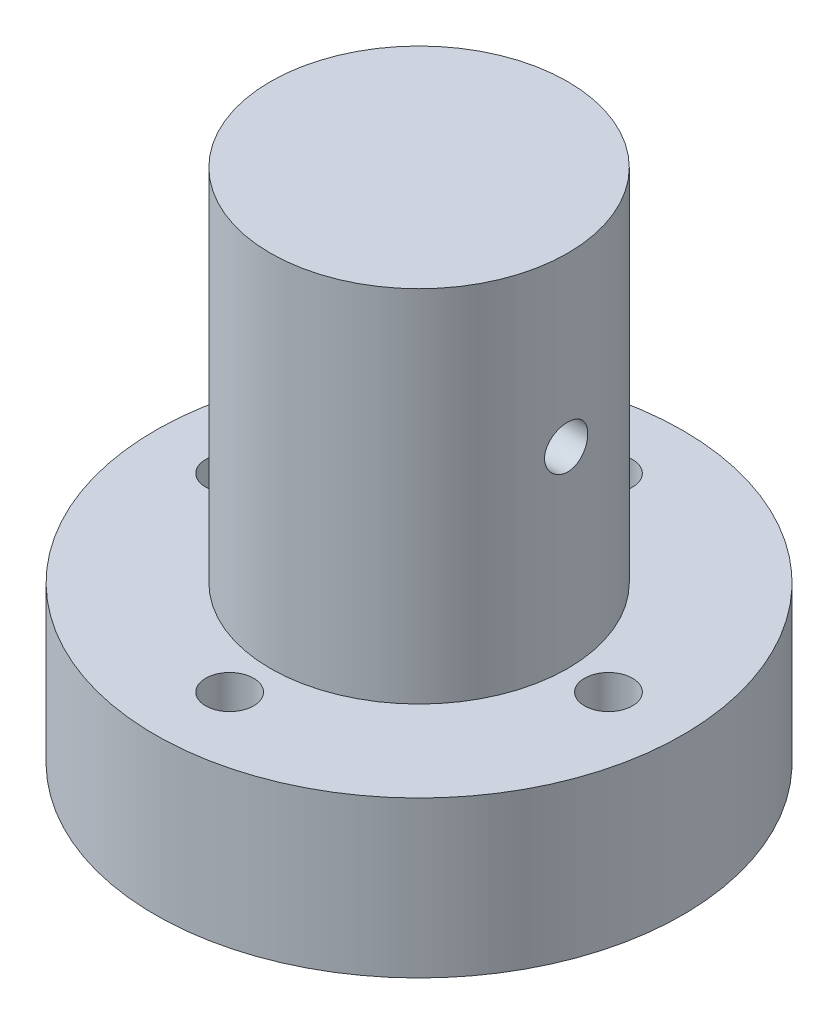
ISO-10303-21;
HEADER;
FILE_DESCRIPTION(('STEP AP214'),'2;1');
FILE_NAME('part.step','',(''),(''),'','','');
FILE_SCHEMA(('AUTOMOTIVE_DESIGN { 1 0 10303 214 1 1 1 1 }'));
ENDSEC;
DATA;
#1=APPLICATION_CONTEXT('core data for automotive mechanical design processes');
#2=APPLICATION_PROTOCOL_DEFINITION('international standard','automotive_design',2000,#1);
#3=PRODUCT_CONTEXT('',#1,'mechanical');
#4=PRODUCT('Part','Part','',(#3));
#5=PRODUCT_RELATED_PRODUCT_CATEGORY('part','',(#4));
#6=PRODUCT_DEFINITION_FORMATION('','',#4);
#7=PRODUCT_DEFINITION_CONTEXT('part definition',#1,'design');
#8=PRODUCT_DEFINITION('design','',#6,#7);
#9=PRODUCT_DEFINITION_SHAPE('','',#8);
#10=(LENGTH_UNIT() NAMED_UNIT(*) SI_UNIT(.MILLI.,.METRE.));
#11=(NAMED_UNIT(*) PLANE_ANGLE_UNIT() SI_UNIT($,.RADIAN.));
#12=(NAMED_UNIT(*) SI_UNIT($,.STERADIAN.) SOLID_ANGLE_UNIT());
#13=UNCERTAINTY_MEASURE_WITH_UNIT(LENGTH_MEASURE(1.E-05),#10,'distance_accuracy_value','');
#14=(GEOMETRIC_REPRESENTATION_CONTEXT(3) GLOBAL_UNCERTAINTY_ASSIGNED_CONTEXT((#13)) GLOBAL_UNIT_ASSIGNED_CONTEXT((#10,
#11,#12)) REPRESENTATION_CONTEXT('',''));
#15=CARTESIAN_POINT('',(0.,0.,0.));
#16=DIRECTION('',(0.,0.,1.));
#17=DIRECTION('',(1.,0.,0.));
#18=AXIS2_PLACEMENT_3D('',#15,#16,#17);
#19=CARTESIAN_POINT('',(0.,6.5,0.));
#20=DIRECTION('',(0.,-1.,0.));
#21=DIRECTION('',(0.,0.,-1.));
#22=AXIS2_PLACEMENT_3D('',#19,#20,#21);
#23=CYLINDRICAL_SURFACE('',#22,11.);
#24=CARTESIAN_POINT('',(0.,6.5,0.));
#25=DIRECTION('',(0.,1.,0.));
#26=DIRECTION('',(0.,0.,1.));
#27=AXIS2_PLACEMENT_3D('',#24,#25,#26);
#28=CIRCLE('',#27,11.);
#29=CARTESIAN_POINT('',(0.,6.5,-11.));
#30=VERTEX_POINT('',#29);
#31=EDGE_CURVE('E10',#30,#30,#28,.T.);
#32=CARTESIAN_POINT('',(0.,0.,0.));
#33=DIRECTION('',(0.,1.,0.));
#34=DIRECTION('',(0.,0.,1.));
#35=AXIS2_PLACEMENT_3D('',#32,#33,#34);
#36=CIRCLE('',#35,11.);
#37=CARTESIAN_POINT('',(0.,0.,-11.));
#38=VERTEX_POINT('',#37);
#39=EDGE_CURVE('E42',#38,#38,#36,.T.);
#40=CARTESIAN_POINT('',(0.,6.5,-11.));
#41=CARTESIAN_POINT('',(0.,6.43229166666667,-11.));
#42=CARTESIAN_POINT('',(0.,6.36458333333333,-11.));
#43=CARTESIAN_POINT('',(0.,6.22916666666667,-11.));
#44=CARTESIAN_POINT('',(0.,6.16145833333333,-11.));
#45=CARTESIAN_POINT('',(0.,6.02604166666667,-11.));
#46=CARTESIAN_POINT('',(0.,5.95833333333333,-11.));
#47=CARTESIAN_POINT('',(0.,5.82291666666667,-11.));
#48=CARTESIAN_POINT('',(0.,5.75520833333333,-11.));
#49=CARTESIAN_POINT('',(0.,5.61979166666667,-11.));
#50=CARTESIAN_POINT('',(0.,5.55208333333333,-11.));
#51=CARTESIAN_POINT('',(0.,5.41666666666667,-11.));
#52=CARTESIAN_POINT('',(0.,5.34895833333333,-11.));
#53=CARTESIAN_POINT('',(0.,5.21354166666667,-11.));
#54=CARTESIAN_POINT('',(0.,5.14583333333333,-11.));
#55=CARTESIAN_POINT('',(0.,5.01041666666667,-11.));
#56=CARTESIAN_POINT('',(0.,4.94270833333333,-11.));
#57=CARTESIAN_POINT('',(0.,4.80729166666667,-11.));
#58=CARTESIAN_POINT('',(0.,4.73958333333333,-11.));
#59=CARTESIAN_POINT('',(0.,4.60416666666667,-11.));
#60=CARTESIAN_POINT('',(0.,4.53645833333333,-11.));
#61=CARTESIAN_POINT('',(0.,4.40104166666667,-11.));
#62=CARTESIAN_POINT('',(0.,4.33333333333333,-11.));
#63=CARTESIAN_POINT('',(0.,4.19791666666667,-11.));
#64=CARTESIAN_POINT('',(0.,4.13020833333333,-11.));
#65=CARTESIAN_POINT('',(0.,3.99479166666667,-11.));
#66=CARTESIAN_POINT('',(0.,3.92708333333333,-11.));
#67=CARTESIAN_POINT('',(0.,3.79166666666667,-11.));
#68=CARTESIAN_POINT('',(0.,3.72395833333333,-11.));
#69=CARTESIAN_POINT('',(0.,3.58854166666667,-11.));
#70=CARTESIAN_POINT('',(0.,3.52083333333333,-11.));
#71=CARTESIAN_POINT('',(0.,3.38541666666667,-11.));
#72=CARTESIAN_POINT('',(0.,3.31770833333333,-11.));
#73=CARTESIAN_POINT('',(0.,3.18229166666667,-11.));
#74=CARTESIAN_POINT('',(0.,3.11458333333333,-11.));
#75=CARTESIAN_POINT('',(0.,2.97916666666667,-11.));
#76=CARTESIAN_POINT('',(0.,2.91145833333333,-11.));
#77=CARTESIAN_POINT('',(0.,2.77604166666667,-11.));
#78=CARTESIAN_POINT('',(0.,2.70833333333333,-11.));
#79=CARTESIAN_POINT('',(0.,2.57291666666667,-11.));
#80=CARTESIAN_POINT('',(0.,2.50520833333333,-11.));
#81=CARTESIAN_POINT('',(0.,2.36979166666667,-11.));
#82=CARTESIAN_POINT('',(0.,2.30208333333333,-11.));
#83=CARTESIAN_POINT('',(0.,2.16666666666667,-11.));
#84=CARTESIAN_POINT('',(0.,2.09895833333333,-11.));
#85=CARTESIAN_POINT('',(0.,1.96354166666667,-11.));
#86=CARTESIAN_POINT('',(0.,1.89583333333333,-11.));
#87=CARTESIAN_POINT('',(0.,1.76041666666667,-11.));
#88=CARTESIAN_POINT('',(0.,1.69270833333333,-11.));
#89=CARTESIAN_POINT('',(0.,1.55729166666667,-11.));
#90=CARTESIAN_POINT('',(0.,1.48958333333333,-11.));
#91=CARTESIAN_POINT('',(0.,1.35416666666667,-11.));
#92=CARTESIAN_POINT('',(0.,1.28645833333333,-11.));
#93=CARTESIAN_POINT('',(0.,1.15104166666667,-11.));
#94=CARTESIAN_POINT('',(0.,1.08333333333333,-11.));
#95=CARTESIAN_POINT('',(0.,0.947916666666667,-11.));
#96=CARTESIAN_POINT('',(0.,0.880208333333333,-11.));
#97=CARTESIAN_POINT('',(0.,0.744791666666667,-11.));
#98=CARTESIAN_POINT('',(0.,0.677083333333333,-11.));
#99=CARTESIAN_POINT('',(0.,0.541666666666667,-11.));
#100=CARTESIAN_POINT('',(0.,0.473958333333333,-11.));
#101=CARTESIAN_POINT('',(0.,0.338541666666667,-11.));
#102=CARTESIAN_POINT('',(0.,0.270833333333334,-11.));
#103=CARTESIAN_POINT('',(0.,0.135416666666667,-11.));
#104=CARTESIAN_POINT('',(0.,0.0677083333333334,-11.));
#105=CARTESIAN_POINT('',(0.,0.,-11.));
#106=B_SPLINE_CURVE_WITH_KNOTS('',3,(#40,#41,#42,#43,#44,#45,#46,#47,#48,#49,#50,#51,#52,#53,
#54,#55,#56,#57,#58,#59,#60,#61,#62,#63,#64,#65,#66,#67,#68,#69,#70,#71,#72,#73,#74,#75,#76,#77,
#78,#79,#80,#81,#82,#83,#84,#85,#86,#87,#88,#89,#90,#91,#92,#93,#94,#95,#96,#97,#98,#99,#100,
#101,#102,#103,#104,#105),.UNSPECIFIED.,.F.,.F.,(4,2,2,2,2,2,2,2,2,2,2,2,2,2,2,2,2,2,2,2,2,2,2,
2,2,2,2,2,2,2,2,2,4),(0.,0.203125,0.40625,0.609375000000001,0.812500000000001,1.015625,1.21875,
1.421875,1.625,1.828125,2.03125,2.234375,2.4375,2.640625,2.84375,3.046875,3.25,3.453125,3.65625,
3.859375,4.0625,4.265625,4.46875,4.671875,4.875,5.078125,5.28125,5.484375,5.6875,5.890625,
6.09375,6.296875,6.5),.UNSPECIFIED.);
#107=EDGE_CURVE('BSEAM31',#30,#38,#106,.T.);
#108=ORIENTED_EDGE('',*,*,#31,.F.);
#109=ORIENTED_EDGE('',*,*,#39,.T.);
#110=ORIENTED_EDGE('',*,*,#107,.T.);
#111=ORIENTED_EDGE('',*,*,#107,.F.);
#112=EDGE_LOOP('',(#108,#110,#109,#111));
#113=FACE_BOUND('',#112,.T.);
#114=ADVANCED_FACE('F31',(#113),#23,.T.);
#115=CARTESIAN_POINT('',(0.,6.5,0.));
#116=DIRECTION('',(0.,1.,0.));
#117=DIRECTION('',(0.,0.,1.));
#118=AXIS2_PLACEMENT_3D('',#115,#116,#117);
#119=PLANE('',#118);
#120=CARTESIAN_POINT('',(0.,6.5,0.));
#121=DIRECTION('',(0.,1.,0.));
#122=DIRECTION('',(0.,0.,1.));
#123=AXIS2_PLACEMENT_3D('',#120,#121,#122);
#124=CIRCLE('',#123,6.2);
#125=CARTESIAN_POINT('',(0.,6.5,6.2));
#126=VERTEX_POINT('',#125);
#127=EDGE_CURVE('E145',#126,#126,#124,.T.);
#128=ORIENTED_EDGE('',*,*,#127,.F.);
#129=EDGE_LOOP('',(#128));
#130=FACE_BOUND('',#129,.T.);
#131=CARTESIAN_POINT('',(0.,6.5,7.9));
#132=DIRECTION('',(0.,1.,0.));
#133=DIRECTION('',(0.,0.,-1.));
#134=AXIS2_PLACEMENT_3D('',#131,#132,#133);
#135=CIRCLE('',#134,0.999999999999999);
#136=CARTESIAN_POINT('',(0.,6.5,8.9));
#137=VERTEX_POINT('',#136);
#138=EDGE_CURVE('E113',#137,#137,#135,.T.);
#139=ORIENTED_EDGE('',*,*,#138,.F.);
#140=EDGE_LOOP('',(#139));
#141=FACE_BOUND('',#140,.T.);
#142=CARTESIAN_POINT('',(-7.9,6.5,0.));
#143=DIRECTION('',(0.,1.,0.));
#144=DIRECTION('',(1.,0.,0.));
#145=AXIS2_PLACEMENT_3D('',#142,#143,#144);
#146=CIRCLE('',#145,0.999999999999999);
#147=CARTESIAN_POINT('',(-7.9,6.5,0.999999999999917));
#148=VERTEX_POINT('',#147);
#149=EDGE_CURVE('E120',#148,#148,#146,.T.);
#150=ORIENTED_EDGE('',*,*,#149,.F.);
#151=EDGE_LOOP('',(#150));
#152=FACE_BOUND('',#151,.T.);
#153=CARTESIAN_POINT('',(7.9,6.5,0.));
#154=DIRECTION('',(0.,1.,0.));
#155=DIRECTION('',(-1.,0.,0.));
#156=AXIS2_PLACEMENT_3D('',#153,#154,#155);
#157=CIRCLE('',#156,0.999999999999999);
#158=CARTESIAN_POINT('',(7.9,6.5,1.00000000000003));
#159=VERTEX_POINT('',#158);
#160=EDGE_CURVE('E117',#159,#159,#157,.T.);
#161=ORIENTED_EDGE('',*,*,#160,.F.);
#162=EDGE_LOOP('',(#161));
#163=FACE_BOUND('',#162,.T.);
#164=CARTESIAN_POINT('',(0.,6.5,-7.9));
#165=DIRECTION('',(0.,1.,0.));
#166=DIRECTION('',(0.,0.,1.));
#167=AXIS2_PLACEMENT_3D('',#164,#165,#166);
#168=CIRCLE('',#167,0.999999999999999);
#169=CARTESIAN_POINT('',(0.,6.5,-6.9));
#170=VERTEX_POINT('',#169);
#171=EDGE_CURVE('E50',#170,#170,#168,.T.);
#172=ORIENTED_EDGE('',*,*,#171,.F.);
#173=EDGE_LOOP('',(#172));
#174=FACE_BOUND('',#173,.T.);
#175=ORIENTED_EDGE('',*,*,#31,.T.);
#176=EDGE_LOOP('',(#175));
#177=FACE_BOUND('',#176,.T.);
#178=ADVANCED_FACE('F75',(#130,#141,#152,#163,#174,#177),#119,.T.);
#179=CARTESIAN_POINT('',(0.,0.,0.));
#180=DIRECTION('',(0.,1.,0.));
#181=DIRECTION('',(0.,0.,1.));
#182=AXIS2_PLACEMENT_3D('',#179,#180,#181);
#183=PLANE('',#182);
#184=CARTESIAN_POINT('',(0.,0.,7.9));
#185=DIRECTION('',(0.,1.,0.));
#186=DIRECTION('',(0.,0.,-1.));
#187=AXIS2_PLACEMENT_3D('',#184,#185,#186);
#188=CIRCLE('',#187,0.999999999999999);
#189=CARTESIAN_POINT('',(0.,0.,8.9));
#190=VERTEX_POINT('',#189);
#191=EDGE_CURVE('E110',#190,#190,#188,.T.);
#192=ORIENTED_EDGE('',*,*,#191,.T.);
#193=EDGE_LOOP('',(#192));
#194=FACE_BOUND('',#193,.T.);
#195=CARTESIAN_POINT('',(-7.9,0.,0.));
#196=DIRECTION('',(0.,1.,0.));
#197=DIRECTION('',(1.,0.,0.));
#198=AXIS2_PLACEMENT_3D('',#195,#196,#197);
#199=CIRCLE('',#198,0.999999999999999);
#200=CARTESIAN_POINT('',(-7.9,0.,0.999999999999917));
#201=VERTEX_POINT('',#200);
#202=EDGE_CURVE('E115',#201,#201,#199,.T.);
#203=ORIENTED_EDGE('',*,*,#202,.T.);
#204=EDGE_LOOP('',(#203));
#205=FACE_BOUND('',#204,.T.);
#206=CARTESIAN_POINT('',(7.9,0.,0.));
#207=DIRECTION('',(0.,1.,0.));
#208=DIRECTION('',(-1.,0.,0.));
#209=AXIS2_PLACEMENT_3D('',#206,#207,#208);
#210=CIRCLE('',#209,0.999999999999999);
#211=CARTESIAN_POINT('',(7.9,0.,1.00000000000003));
#212=VERTEX_POINT('',#211);
#213=EDGE_CURVE('E127',#212,#212,#210,.T.);
#214=ORIENTED_EDGE('',*,*,#213,.T.);
#215=EDGE_LOOP('',(#214));
#216=FACE_BOUND('',#215,.T.);
#217=CARTESIAN_POINT('',(0.,0.,-7.9));
#218=DIRECTION('',(0.,1.,0.));
#219=DIRECTION('',(0.,0.,1.));
#220=AXIS2_PLACEMENT_3D('',#217,#218,#219);
#221=CIRCLE('',#220,0.999999999999999);
#222=CARTESIAN_POINT('',(0.,0.,-6.9));
#223=VERTEX_POINT('',#222);
#224=EDGE_CURVE('E47',#223,#223,#221,.T.);
#225=ORIENTED_EDGE('',*,*,#224,.T.);
#226=EDGE_LOOP('',(#225));
#227=FACE_BOUND('',#226,.T.);
#228=ORIENTED_EDGE('',*,*,#39,.F.);
#229=EDGE_LOOP('',(#228));
#230=FACE_BOUND('',#229,.T.);
#231=ADVANCED_FACE('F80',(#194,#205,#216,#227,#230),#183,.F.);
#232=CARTESIAN_POINT('',(0.,0.,-7.9));
#233=DIRECTION('',(0.,1.,0.));
#234=DIRECTION('',(0.,0.,1.));
#235=AXIS2_PLACEMENT_3D('',#232,#233,#234);
#236=CYLINDRICAL_SURFACE('',#235,0.999999999999999);
#237=CARTESIAN_POINT('',(0.,0.,-6.9));
#238=CARTESIAN_POINT('',(0.,0.0677083333333332,-6.9));
#239=CARTESIAN_POINT('',(0.,0.135416666666667,-6.9));
#240=CARTESIAN_POINT('',(0.,0.270833333333333,-6.9));
#241=CARTESIAN_POINT('',(0.,0.338541666666667,-6.9));
#242=CARTESIAN_POINT('',(0.,0.473958333333333,-6.9));
#243=CARTESIAN_POINT('',(0.,0.541666666666667,-6.9));
#244=CARTESIAN_POINT('',(0.,0.677083333333333,-6.9));
#245=CARTESIAN_POINT('',(0.,0.744791666666667,-6.9));
#246=CARTESIAN_POINT('',(0.,0.880208333333333,-6.9));
#247=CARTESIAN_POINT('',(0.,0.947916666666667,-6.9));
#248=CARTESIAN_POINT('',(0.,1.08333333333333,-6.9));
#249=CARTESIAN_POINT('',(0.,1.15104166666667,-6.9));
#250=CARTESIAN_POINT('',(0.,1.28645833333333,-6.9));
#251=CARTESIAN_POINT('',(0.,1.35416666666667,-6.9));
#252=CARTESIAN_POINT('',(0.,1.48958333333333,-6.9));
#253=CARTESIAN_POINT('',(0.,1.55729166666667,-6.9));
#254=CARTESIAN_POINT('',(0.,1.69270833333333,-6.9));
#255=CARTESIAN_POINT('',(0.,1.76041666666667,-6.9));
#256=CARTESIAN_POINT('',(0.,1.89583333333333,-6.9));
#257=CARTESIAN_POINT('',(0.,1.96354166666667,-6.9));
#258=CARTESIAN_POINT('',(0.,2.09895833333333,-6.9));
#259=CARTESIAN_POINT('',(0.,2.16666666666667,-6.9));
#260=CARTESIAN_POINT('',(0.,2.30208333333333,-6.9));
#261=CARTESIAN_POINT('',(0.,2.36979166666667,-6.9));
#262=CARTESIAN_POINT('',(0.,2.50520833333333,-6.9));
#263=CARTESIAN_POINT('',(0.,2.57291666666667,-6.9));
#264=CARTESIAN_POINT('',(0.,2.70833333333333,-6.9));
#265=CARTESIAN_POINT('',(0.,2.77604166666667,-6.9));
#266=CARTESIAN_POINT('',(0.,2.91145833333333,-6.9));
#267=CARTESIAN_POINT('',(0.,2.97916666666667,-6.9));
#268=CARTESIAN_POINT('',(0.,3.11458333333333,-6.9));
#269=CARTESIAN_POINT('',(0.,3.18229166666667,-6.9));
#270=CARTESIAN_POINT('',(0.,3.31770833333333,-6.9));
#271=CARTESIAN_POINT('',(0.,3.38541666666667,-6.9));
#272=CARTESIAN_POINT('',(0.,3.52083333333333,-6.9));
#273=CARTESIAN_POINT('',(0.,3.58854166666667,-6.9));
#274=CARTESIAN_POINT('',(0.,3.72395833333333,-6.9));
#275=CARTESIAN_POINT('',(0.,3.79166666666667,-6.9));
#276=CARTESIAN_POINT('',(0.,3.92708333333333,-6.9));
#277=CARTESIAN_POINT('',(0.,3.99479166666667,-6.9));
#278=CARTESIAN_POINT('',(0.,4.13020833333333,-6.9));
#279=CARTESIAN_POINT('',(0.,4.19791666666667,-6.9));
#280=CARTESIAN_POINT('',(0.,4.33333333333333,-6.9));
#281=CARTESIAN_POINT('',(0.,4.40104166666667,-6.9));
#282=CARTESIAN_POINT('',(0.,4.53645833333333,-6.9));
#283=CARTESIAN_POINT('',(0.,4.60416666666667,-6.9));
#284=CARTESIAN_POINT('',(0.,4.73958333333333,-6.9));
#285=CARTESIAN_POINT('',(0.,4.80729166666667,-6.9));
#286=CARTESIAN_POINT('',(0.,4.94270833333333,-6.9));
#287=CARTESIAN_POINT('',(0.,5.01041666666667,-6.9));
#288=CARTESIAN_POINT('',(0.,5.14583333333333,-6.9));
#289=CARTESIAN_POINT('',(0.,5.21354166666667,-6.9));
#290=CARTESIAN_POINT('',(0.,5.34895833333333,-6.9));
#291=CARTESIAN_POINT('',(0.,5.41666666666667,-6.9));
#292=CARTESIAN_POINT('',(0.,5.55208333333333,-6.9));
#293=CARTESIAN_POINT('',(0.,5.61979166666667,-6.9));
#294=CARTESIAN_POINT('',(0.,5.75520833333333,-6.9));
#295=CARTESIAN_POINT('',(0.,5.82291666666667,-6.9));
#296=CARTESIAN_POINT('',(0.,5.95833333333333,-6.9));
#297=CARTESIAN_POINT('',(0.,6.02604166666667,-6.9));
#298=CARTESIAN_POINT('',(0.,6.16145833333333,-6.9));
#299=CARTESIAN_POINT('',(0.,6.22916666666667,-6.9));
#300=CARTESIAN_POINT('',(0.,6.36458333333333,-6.9));
#301=CARTESIAN_POINT('',(0.,6.43229166666667,-6.9));
#302=CARTESIAN_POINT('',(0.,6.5,-6.9));
#303=B_SPLINE_CURVE_WITH_KNOTS('',3,(#237,#238,#239,#240,#241,#242,#243,#244,#245,#246,#247,
#248,#249,#250,#251,#252,#253,#254,#255,#256,#257,#258,#259,#260,#261,#262,#263,#264,#265,#266,
#267,#268,#269,#270,#271,#272,#273,#274,#275,#276,#277,#278,#279,#280,#281,#282,#283,#284,#285,
#286,#287,#288,#289,#290,#291,#292,#293,#294,#295,#296,#297,#298,#299,#300,#301,#302),
.UNSPECIFIED.,.F.,.F.,(4,2,2,2,2,2,2,2,2,2,2,2,2,2,2,2,2,2,2,2,2,2,2,2,2,2,2,2,2,2,2,2,4),(0.,
0.203125,0.40625,0.609375,0.8125,1.015625,1.21875,1.421875,1.625,1.828125,2.03125,2.234375,
2.4375,2.640625,2.84375,3.046875,3.25,3.453125,3.65625,3.859375,4.0625,4.265625,4.46875,
4.671875,4.875,5.078125,5.28125,5.484375,5.6875,5.890625,6.09375,6.296875,6.5),.UNSPECIFIED.);
#304=EDGE_CURVE('BSEAM87',#223,#170,#303,.T.);
#305=ORIENTED_EDGE('',*,*,#224,.F.);
#306=ORIENTED_EDGE('',*,*,#171,.T.);
#307=ORIENTED_EDGE('',*,*,#304,.T.);
#308=ORIENTED_EDGE('',*,*,#304,.F.);
#309=EDGE_LOOP('',(#305,#307,#306,#308));
#310=FACE_BOUND('',#309,.T.);
#311=ADVANCED_FACE('F87',(#310),#236,.F.);
#312=CARTESIAN_POINT('',(7.9,0.,0.));
#313=DIRECTION('',(0.,1.,0.));
#314=DIRECTION('',(0.,0.,1.));
#315=AXIS2_PLACEMENT_3D('',#312,#313,#314);
#316=CYLINDRICAL_SURFACE('',#315,0.999999999999999);
#317=CARTESIAN_POINT('',(7.9,0.,1.00000000000003));
#318=CARTESIAN_POINT('',(7.9,0.0677083333333332,1.00000000000003));
#319=CARTESIAN_POINT('',(7.9,0.135416666666667,1.00000000000003));
#320=CARTESIAN_POINT('',(7.9,0.270833333333333,1.00000000000003));
#321=CARTESIAN_POINT('',(7.9,0.338541666666667,1.00000000000003));
#322=CARTESIAN_POINT('',(7.9,0.473958333333333,1.00000000000003));
#323=CARTESIAN_POINT('',(7.9,0.541666666666667,1.00000000000003));
#324=CARTESIAN_POINT('',(7.9,0.677083333333333,1.00000000000003));
#325=CARTESIAN_POINT('',(7.9,0.744791666666667,1.00000000000003));
#326=CARTESIAN_POINT('',(7.9,0.880208333333333,1.00000000000003));
#327=CARTESIAN_POINT('',(7.9,0.947916666666667,1.00000000000003));
#328=CARTESIAN_POINT('',(7.9,1.08333333333333,1.00000000000003));
#329=CARTESIAN_POINT('',(7.9,1.15104166666667,1.00000000000003));
#330=CARTESIAN_POINT('',(7.9,1.28645833333333,1.00000000000003));
#331=CARTESIAN_POINT('',(7.9,1.35416666666667,1.00000000000003));
#332=CARTESIAN_POINT('',(7.9,1.48958333333333,1.00000000000003));
#333=CARTESIAN_POINT('',(7.9,1.55729166666667,1.00000000000003));
#334=CARTESIAN_POINT('',(7.9,1.69270833333333,1.00000000000003));
#335=CARTESIAN_POINT('',(7.9,1.76041666666667,1.00000000000003));
#336=CARTESIAN_POINT('',(7.9,1.89583333333333,1.00000000000003));
#337=CARTESIAN_POINT('',(7.9,1.96354166666667,1.00000000000003));
#338=CARTESIAN_POINT('',(7.9,2.09895833333333,1.00000000000003));
#339=CARTESIAN_POINT('',(7.9,2.16666666666667,1.00000000000003));
#340=CARTESIAN_POINT('',(7.9,2.30208333333333,1.00000000000003));
#341=CARTESIAN_POINT('',(7.9,2.36979166666667,1.00000000000003));
#342=CARTESIAN_POINT('',(7.9,2.50520833333333,1.00000000000003));
#343=CARTESIAN_POINT('',(7.9,2.57291666666667,1.00000000000003));
#344=CARTESIAN_POINT('',(7.9,2.70833333333333,1.00000000000003));
#345=CARTESIAN_POINT('',(7.9,2.77604166666667,1.00000000000003));
#346=CARTESIAN_POINT('',(7.9,2.91145833333333,1.00000000000003));
#347=CARTESIAN_POINT('',(7.9,2.97916666666667,1.00000000000003));
#348=CARTESIAN_POINT('',(7.9,3.11458333333333,1.00000000000003));
#349=CARTESIAN_POINT('',(7.9,3.18229166666667,1.00000000000003));
#350=CARTESIAN_POINT('',(7.9,3.31770833333333,1.00000000000003));
#351=CARTESIAN_POINT('',(7.9,3.38541666666667,1.00000000000003));
#352=CARTESIAN_POINT('',(7.9,3.52083333333333,1.00000000000003));
#353=CARTESIAN_POINT('',(7.9,3.58854166666667,1.00000000000003));
#354=CARTESIAN_POINT('',(7.9,3.72395833333333,1.00000000000003));
#355=CARTESIAN_POINT('',(7.9,3.79166666666667,1.00000000000003));
#356=CARTESIAN_POINT('',(7.9,3.92708333333333,1.00000000000003));
#357=CARTESIAN_POINT('',(7.9,3.99479166666667,1.00000000000003));
#358=CARTESIAN_POINT('',(7.9,4.13020833333333,1.00000000000003));
#359=CARTESIAN_POINT('',(7.9,4.19791666666667,1.00000000000003));
#360=CARTESIAN_POINT('',(7.9,4.33333333333333,1.00000000000003));
#361=CARTESIAN_POINT('',(7.9,4.40104166666667,1.00000000000003));
#362=CARTESIAN_POINT('',(7.9,4.53645833333333,1.00000000000003));
#363=CARTESIAN_POINT('',(7.9,4.60416666666667,1.00000000000003));
#364=CARTESIAN_POINT('',(7.9,4.73958333333333,1.00000000000003));
#365=CARTESIAN_POINT('',(7.9,4.80729166666667,1.00000000000003));
#366=CARTESIAN_POINT('',(7.9,4.94270833333333,1.00000000000003));
#367=CARTESIAN_POINT('',(7.9,5.01041666666667,1.00000000000003));
#368=CARTESIAN_POINT('',(7.9,5.14583333333333,1.00000000000003));
#369=CARTESIAN_POINT('',(7.9,5.21354166666667,1.00000000000003));
#370=CARTESIAN_POINT('',(7.9,5.34895833333333,1.00000000000003));
#371=CARTESIAN_POINT('',(7.9,5.41666666666667,1.00000000000003));
#372=CARTESIAN_POINT('',(7.9,5.55208333333333,1.00000000000003));
#373=CARTESIAN_POINT('',(7.9,5.61979166666667,1.00000000000003));
#374=CARTESIAN_POINT('',(7.9,5.75520833333333,1.00000000000003));
#375=CARTESIAN_POINT('',(7.9,5.82291666666667,1.00000000000003));
#376=CARTESIAN_POINT('',(7.9,5.95833333333333,1.00000000000003));
#377=CARTESIAN_POINT('',(7.9,6.02604166666667,1.00000000000003));
#378=CARTESIAN_POINT('',(7.9,6.16145833333333,1.00000000000003));
#379=CARTESIAN_POINT('',(7.9,6.22916666666667,1.00000000000003));
#380=CARTESIAN_POINT('',(7.9,6.36458333333333,1.00000000000003));
#381=CARTESIAN_POINT('',(7.9,6.43229166666667,1.00000000000003));
#382=CARTESIAN_POINT('',(7.9,6.5,1.00000000000003));
#383=B_SPLINE_CURVE_WITH_KNOTS('',3,(#317,#318,#319,#320,#321,#322,#323,#324,#325,#326,#327,
#328,#329,#330,#331,#332,#333,#334,#335,#336,#337,#338,#339,#340,#341,#342,#343,#344,#345,#346,
#347,#348,#349,#350,#351,#352,#353,#354,#355,#356,#357,#358,#359,#360,#361,#362,#363,#364,#365,
#366,#367,#368,#369,#370,#371,#372,#373,#374,#375,#376,#377,#378,#379,#380,#381,#382),
.UNSPECIFIED.,.F.,.F.,(4,2,2,2,2,2,2,2,2,2,2,2,2,2,2,2,2,2,2,2,2,2,2,2,2,2,2,2,2,2,2,2,4),(0.,
0.203125,0.40625,0.609375,0.8125,1.015625,1.21875,1.421875,1.625,1.828125,2.03125,2.234375,
2.4375,2.640625,2.84375,3.046875,3.25,3.453125,3.65625,3.859375,4.0625,4.265625,4.46875,
4.671875,4.875,5.078125,5.28125,5.484375,5.6875,5.890625,6.09375,6.296875,6.5),.UNSPECIFIED.);
#384=EDGE_CURVE('BSEAM92',#212,#159,#383,.T.);
#385=ORIENTED_EDGE('',*,*,#213,.F.);
#386=ORIENTED_EDGE('',*,*,#160,.T.);
#387=ORIENTED_EDGE('',*,*,#384,.T.);
#388=ORIENTED_EDGE('',*,*,#384,.F.);
#389=EDGE_LOOP('',(#385,#387,#386,#388));
#390=FACE_BOUND('',#389,.T.);
#391=ADVANCED_FACE('F92',(#390),#316,.F.);
#392=CARTESIAN_POINT('',(-7.9,0.,0.));
#393=DIRECTION('',(0.,1.,0.));
#394=DIRECTION('',(0.,0.,1.));
#395=AXIS2_PLACEMENT_3D('',#392,#393,#394);
#396=CYLINDRICAL_SURFACE('',#395,0.999999999999999);
#397=CARTESIAN_POINT('',(-7.9,0.,0.999999999999917));
#398=CARTESIAN_POINT('',(-7.9,0.0677083333333332,0.999999999999917));
#399=CARTESIAN_POINT('',(-7.9,0.135416666666667,0.999999999999917));
#400=CARTESIAN_POINT('',(-7.9,0.270833333333333,0.999999999999917));
#401=CARTESIAN_POINT('',(-7.9,0.338541666666667,0.999999999999917));
#402=CARTESIAN_POINT('',(-7.9,0.473958333333333,0.999999999999917));
#403=CARTESIAN_POINT('',(-7.9,0.541666666666667,0.999999999999917));
#404=CARTESIAN_POINT('',(-7.9,0.677083333333333,0.999999999999917));
#405=CARTESIAN_POINT('',(-7.9,0.744791666666667,0.999999999999917));
#406=CARTESIAN_POINT('',(-7.9,0.880208333333333,0.999999999999917));
#407=CARTESIAN_POINT('',(-7.9,0.947916666666667,0.999999999999917));
#408=CARTESIAN_POINT('',(-7.9,1.08333333333333,0.999999999999917));
#409=CARTESIAN_POINT('',(-7.9,1.15104166666667,0.999999999999917));
#410=CARTESIAN_POINT('',(-7.9,1.28645833333333,0.999999999999917));
#411=CARTESIAN_POINT('',(-7.9,1.35416666666667,0.999999999999917));
#412=CARTESIAN_POINT('',(-7.9,1.48958333333333,0.999999999999917));
#413=CARTESIAN_POINT('',(-7.9,1.55729166666667,0.999999999999917));
#414=CARTESIAN_POINT('',(-7.9,1.69270833333333,0.999999999999917));
#415=CARTESIAN_POINT('',(-7.9,1.76041666666667,0.999999999999917));
#416=CARTESIAN_POINT('',(-7.9,1.89583333333333,0.999999999999917));
#417=CARTESIAN_POINT('',(-7.9,1.96354166666667,0.999999999999917));
#418=CARTESIAN_POINT('',(-7.9,2.09895833333333,0.999999999999917));
#419=CARTESIAN_POINT('',(-7.9,2.16666666666667,0.999999999999917));
#420=CARTESIAN_POINT('',(-7.9,2.30208333333333,0.999999999999917));
#421=CARTESIAN_POINT('',(-7.9,2.36979166666667,0.999999999999917));
#422=CARTESIAN_POINT('',(-7.9,2.50520833333333,0.999999999999917));
#423=CARTESIAN_POINT('',(-7.9,2.57291666666667,0.999999999999917));
#424=CARTESIAN_POINT('',(-7.9,2.70833333333333,0.999999999999917));
#425=CARTESIAN_POINT('',(-7.9,2.77604166666667,0.999999999999917));
#426=CARTESIAN_POINT('',(-7.9,2.91145833333333,0.999999999999917));
#427=CARTESIAN_POINT('',(-7.9,2.97916666666667,0.999999999999917));
#428=CARTESIAN_POINT('',(-7.9,3.11458333333333,0.999999999999917));
#429=CARTESIAN_POINT('',(-7.9,3.18229166666667,0.999999999999917));
#430=CARTESIAN_POINT('',(-7.9,3.31770833333333,0.999999999999917));
#431=CARTESIAN_POINT('',(-7.9,3.38541666666667,0.999999999999917));
#432=CARTESIAN_POINT('',(-7.9,3.52083333333333,0.999999999999917));
#433=CARTESIAN_POINT('',(-7.9,3.58854166666667,0.999999999999917));
#434=CARTESIAN_POINT('',(-7.9,3.72395833333333,0.999999999999917));
#435=CARTESIAN_POINT('',(-7.9,3.79166666666667,0.999999999999917));
#436=CARTESIAN_POINT('',(-7.9,3.92708333333333,0.999999999999917));
#437=CARTESIAN_POINT('',(-7.9,3.99479166666667,0.999999999999917));
#438=CARTESIAN_POINT('',(-7.9,4.13020833333333,0.999999999999917));
#439=CARTESIAN_POINT('',(-7.9,4.19791666666667,0.999999999999917));
#440=CARTESIAN_POINT('',(-7.9,4.33333333333333,0.999999999999917));
#441=CARTESIAN_POINT('',(-7.9,4.40104166666667,0.999999999999917));
#442=CARTESIAN_POINT('',(-7.9,4.53645833333333,0.999999999999917));
#443=CARTESIAN_POINT('',(-7.9,4.60416666666667,0.999999999999917));
#444=CARTESIAN_POINT('',(-7.9,4.73958333333333,0.999999999999917));
#445=CARTESIAN_POINT('',(-7.9,4.80729166666667,0.999999999999917));
#446=CARTESIAN_POINT('',(-7.9,4.94270833333333,0.999999999999917));
#447=CARTESIAN_POINT('',(-7.9,5.01041666666667,0.999999999999917));
#448=CARTESIAN_POINT('',(-7.9,5.14583333333333,0.999999999999917));
#449=CARTESIAN_POINT('',(-7.9,5.21354166666667,0.999999999999917));
#450=CARTESIAN_POINT('',(-7.9,5.34895833333333,0.999999999999917));
#451=CARTESIAN_POINT('',(-7.9,5.41666666666667,0.999999999999917));
#452=CARTESIAN_POINT('',(-7.9,5.55208333333333,0.999999999999917));
#453=CARTESIAN_POINT('',(-7.9,5.61979166666667,0.999999999999917));
#454=CARTESIAN_POINT('',(-7.9,5.75520833333333,0.999999999999917));
#455=CARTESIAN_POINT('',(-7.9,5.82291666666667,0.999999999999917));
#456=CARTESIAN_POINT('',(-7.9,5.95833333333333,0.999999999999917));
#457=CARTESIAN_POINT('',(-7.9,6.02604166666667,0.999999999999917));
#458=CARTESIAN_POINT('',(-7.9,6.16145833333333,0.999999999999917));
#459=CARTESIAN_POINT('',(-7.9,6.22916666666667,0.999999999999917));
#460=CARTESIAN_POINT('',(-7.9,6.36458333333333,0.999999999999917));
#461=CARTESIAN_POINT('',(-7.9,6.43229166666667,0.999999999999917));
#462=CARTESIAN_POINT('',(-7.9,6.5,0.999999999999917));
#463=B_SPLINE_CURVE_WITH_KNOTS('',3,(#397,#398,#399,#400,#401,#402,#403,#404,#405,#406,#407,
#408,#409,#410,#411,#412,#413,#414,#415,#416,#417,#418,#419,#420,#421,#422,#423,#424,#425,#426,
#427,#428,#429,#430,#431,#432,#433,#434,#435,#436,#437,#438,#439,#440,#441,#442,#443,#444,#445,
#446,#447,#448,#449,#450,#451,#452,#453,#454,#455,#456,#457,#458,#459,#460,#461,#462),
.UNSPECIFIED.,.F.,.F.,(4,2,2,2,2,2,2,2,2,2,2,2,2,2,2,2,2,2,2,2,2,2,2,2,2,2,2,2,2,2,2,2,4),(0.,
0.203125,0.40625,0.609375,0.8125,1.015625,1.21875,1.421875,1.625,1.828125,2.03125,2.234375,
2.4375,2.640625,2.84375,3.046875,3.25,3.453125,3.65625,3.859375,4.0625,4.265625,4.46875,
4.671875,4.875,5.078125,5.28125,5.484375,5.6875,5.890625,6.09375,6.296875,6.5),.UNSPECIFIED.);
#464=EDGE_CURVE('BSEAM100',#201,#148,#463,.T.);
#465=ORIENTED_EDGE('',*,*,#202,.F.);
#466=ORIENTED_EDGE('',*,*,#149,.T.);
#467=ORIENTED_EDGE('',*,*,#464,.T.);
#468=ORIENTED_EDGE('',*,*,#464,.F.);
#469=EDGE_LOOP('',(#465,#467,#466,#468));
#470=FACE_BOUND('',#469,.T.);
#471=ADVANCED_FACE('F100',(#470),#396,.F.);
#472=CARTESIAN_POINT('',(0.,0.,7.9));
#473=DIRECTION('',(0.,1.,0.));
#474=DIRECTION('',(0.,0.,1.));
#475=AXIS2_PLACEMENT_3D('',#472,#473,#474);
#476=CYLINDRICAL_SURFACE('',#475,0.999999999999999);
#477=CARTESIAN_POINT('',(0.,0.,8.9));
#478=CARTESIAN_POINT('',(0.,0.0677083333333332,8.9));
#479=CARTESIAN_POINT('',(0.,0.135416666666667,8.9));
#480=CARTESIAN_POINT('',(0.,0.270833333333333,8.9));
#481=CARTESIAN_POINT('',(0.,0.338541666666667,8.9));
#482=CARTESIAN_POINT('',(0.,0.473958333333333,8.9));
#483=CARTESIAN_POINT('',(0.,0.541666666666667,8.9));
#484=CARTESIAN_POINT('',(0.,0.677083333333333,8.9));
#485=CARTESIAN_POINT('',(0.,0.744791666666667,8.9));
#486=CARTESIAN_POINT('',(0.,0.880208333333333,8.9));
#487=CARTESIAN_POINT('',(0.,0.947916666666667,8.9));
#488=CARTESIAN_POINT('',(0.,1.08333333333333,8.9));
#489=CARTESIAN_POINT('',(0.,1.15104166666667,8.9));
#490=CARTESIAN_POINT('',(0.,1.28645833333333,8.9));
#491=CARTESIAN_POINT('',(0.,1.35416666666667,8.9));
#492=CARTESIAN_POINT('',(0.,1.48958333333333,8.9));
#493=CARTESIAN_POINT('',(0.,1.55729166666667,8.9));
#494=CARTESIAN_POINT('',(0.,1.69270833333333,8.9));
#495=CARTESIAN_POINT('',(0.,1.76041666666667,8.9));
#496=CARTESIAN_POINT('',(0.,1.89583333333333,8.9));
#497=CARTESIAN_POINT('',(0.,1.96354166666667,8.9));
#498=CARTESIAN_POINT('',(0.,2.09895833333333,8.9));
#499=CARTESIAN_POINT('',(0.,2.16666666666667,8.9));
#500=CARTESIAN_POINT('',(0.,2.30208333333333,8.9));
#501=CARTESIAN_POINT('',(0.,2.36979166666667,8.9));
#502=CARTESIAN_POINT('',(0.,2.50520833333333,8.9));
#503=CARTESIAN_POINT('',(0.,2.57291666666667,8.9));
#504=CARTESIAN_POINT('',(0.,2.70833333333333,8.9));
#505=CARTESIAN_POINT('',(0.,2.77604166666667,8.9));
#506=CARTESIAN_POINT('',(0.,2.91145833333333,8.9));
#507=CARTESIAN_POINT('',(0.,2.97916666666667,8.9));
#508=CARTESIAN_POINT('',(0.,3.11458333333333,8.9));
#509=CARTESIAN_POINT('',(0.,3.18229166666667,8.9));
#510=CARTESIAN_POINT('',(0.,3.31770833333333,8.9));
#511=CARTESIAN_POINT('',(0.,3.38541666666667,8.9));
#512=CARTESIAN_POINT('',(0.,3.52083333333333,8.9));
#513=CARTESIAN_POINT('',(0.,3.58854166666667,8.9));
#514=CARTESIAN_POINT('',(0.,3.72395833333333,8.9));
#515=CARTESIAN_POINT('',(0.,3.79166666666667,8.9));
#516=CARTESIAN_POINT('',(0.,3.92708333333333,8.9));
#517=CARTESIAN_POINT('',(0.,3.99479166666667,8.9));
#518=CARTESIAN_POINT('',(0.,4.13020833333333,8.9));
#519=CARTESIAN_POINT('',(0.,4.19791666666667,8.9));
#520=CARTESIAN_POINT('',(0.,4.33333333333333,8.9));
#521=CARTESIAN_POINT('',(0.,4.40104166666667,8.9));
#522=CARTESIAN_POINT('',(0.,4.53645833333333,8.9));
#523=CARTESIAN_POINT('',(0.,4.60416666666667,8.9));
#524=CARTESIAN_POINT('',(0.,4.73958333333333,8.9));
#525=CARTESIAN_POINT('',(0.,4.80729166666667,8.9));
#526=CARTESIAN_POINT('',(0.,4.94270833333333,8.9));
#527=CARTESIAN_POINT('',(0.,5.01041666666667,8.9));
#528=CARTESIAN_POINT('',(0.,5.14583333333333,8.9));
#529=CARTESIAN_POINT('',(0.,5.21354166666667,8.9));
#530=CARTESIAN_POINT('',(0.,5.34895833333333,8.9));
#531=CARTESIAN_POINT('',(0.,5.41666666666667,8.9));
#532=CARTESIAN_POINT('',(0.,5.55208333333333,8.9));
#533=CARTESIAN_POINT('',(0.,5.61979166666667,8.9));
#534=CARTESIAN_POINT('',(0.,5.75520833333333,8.9));
#535=CARTESIAN_POINT('',(0.,5.82291666666667,8.9));
#536=CARTESIAN_POINT('',(0.,5.95833333333333,8.9));
#537=CARTESIAN_POINT('',(0.,6.02604166666667,8.9));
#538=CARTESIAN_POINT('',(0.,6.16145833333333,8.9));
#539=CARTESIAN_POINT('',(0.,6.22916666666667,8.9));
#540=CARTESIAN_POINT('',(0.,6.36458333333333,8.9));
#541=CARTESIAN_POINT('',(0.,6.43229166666667,8.9));
#542=CARTESIAN_POINT('',(0.,6.5,8.9));
#543=B_SPLINE_CURVE_WITH_KNOTS('',3,(#477,#478,#479,#480,#481,#482,#483,#484,#485,#486,#487,
#488,#489,#490,#491,#492,#493,#494,#495,#496,#497,#498,#499,#500,#501,#502,#503,#504,#505,#506,
#507,#508,#509,#510,#511,#512,#513,#514,#515,#516,#517,#518,#519,#520,#521,#522,#523,#524,#525,
#526,#527,#528,#529,#530,#531,#532,#533,#534,#535,#536,#537,#538,#539,#540,#541,#542),
.UNSPECIFIED.,.F.,.F.,(4,2,2,2,2,2,2,2,2,2,2,2,2,2,2,2,2,2,2,2,2,2,2,2,2,2,2,2,2,2,2,2,4),(0.,
0.203125,0.40625,0.609375,0.8125,1.015625,1.21875,1.421875,1.625,1.828125,2.03125,2.234375,
2.4375,2.640625,2.84375,3.046875,3.25,3.453125,3.65625,3.859375,4.0625,4.265625,4.46875,
4.671875,4.875,5.078125,5.28125,5.484375,5.6875,5.890625,6.09375,6.296875,6.5),.UNSPECIFIED.);
#544=EDGE_CURVE('BSEAM71',#190,#137,#543,.T.);
#545=ORIENTED_EDGE('',*,*,#191,.F.);
#546=ORIENTED_EDGE('',*,*,#138,.T.);
#547=ORIENTED_EDGE('',*,*,#544,.T.);
#548=ORIENTED_EDGE('',*,*,#544,.F.);
#549=EDGE_LOOP('',(#545,#547,#546,#548));
#550=FACE_BOUND('',#549,.T.);
#551=ADVANCED_FACE('F71',(#550),#476,.F.);
#552=CARTESIAN_POINT('',(0.,21.5,0.));
#553=DIRECTION('',(0.,-1.,0.));
#554=DIRECTION('',(0.,0.,-1.));
#555=AXIS2_PLACEMENT_3D('',#552,#553,#554);
#556=CYLINDRICAL_SURFACE('',#555,6.2);
#557=CARTESIAN_POINT('',(-6.134329629226,14.5,-0.9));
#558=CARTESIAN_POINT('',(-6.13433044813221,14.5502668259947,-0.899997910091214));
#559=CARTESIAN_POINT('',(-6.13495416797106,14.6005632968345,-0.895774509246188));
#560=CARTESIAN_POINT('',(-6.1373801209585,14.6997513495931,-0.878996214132143));
#561=CARTESIAN_POINT('',(-6.13918352059698,14.7486414908996,-0.866433073186831));
#562=CARTESIAN_POINT('',(-6.14376036830178,14.8435667307723,-0.833357921248702));
#563=CARTESIAN_POINT('',(-6.14653308965313,14.8896039378699,-0.812851863938618));
#564=CARTESIAN_POINT('',(-6.15273529976697,14.9775770776818,-0.76448674465092));
#565=CARTESIAN_POINT('',(-6.15616469358321,15.0195136019784,-0.73662874544777));
#566=CARTESIAN_POINT('',(-6.16332262813686,15.0984166171037,-0.674127128646224));
#567=CARTESIAN_POINT('',(-6.16705302180964,15.135347869435,-0.639439232185835));
#568=CARTESIAN_POINT('',(-6.17437607281923,15.2028868246069,-0.564358052941388));
#569=CARTESIAN_POINT('',(-6.17796872272833,15.2334941868263,-0.523964463031035));
#570=CARTESIAN_POINT('',(-6.18463080314111,15.2876458707618,-0.438393565118669));
#571=CARTESIAN_POINT('',(-6.18769781082318,15.3111578473417,-0.393195583501964));
#572=CARTESIAN_POINT('',(-6.19294254510799,15.3502438566865,-0.299440235587147));
#573=CARTESIAN_POINT('',(-6.19512031578037,15.3658182828373,-0.250883035907809));
#574=CARTESIAN_POINT('',(-6.19832813198493,15.3884805564842,-0.15215010214093));
#575=CARTESIAN_POINT('',(-6.19936614474349,15.3956273418923,-0.101988159165364));
#576=CARTESIAN_POINT('',(-6.20020477573507,15.4014143971644,-0.00116700607010907));
#577=CARTESIAN_POINT('',(-6.20000545859318,15.400055111296,0.0494921779409682));
#578=CARTESIAN_POINT('',(-6.1983982696861,15.3889152699033,0.149467906928596));
#579=CARTESIAN_POINT('',(-6.19699949728894,15.3791981175633,0.198791683641308));
#580=CARTESIAN_POINT('',(-6.19316071016697,15.3517178151323,0.295101051626672));
#581=CARTESIAN_POINT('',(-6.1907206700404,15.3339544687536,0.342086585826623));
#582=CARTESIAN_POINT('',(-6.18505785061491,15.2908205873065,0.432578535246197));
#583=CARTESIAN_POINT('',(-6.18183231678272,15.2654232064657,0.476071974777937));
#584=CARTESIAN_POINT('',(-6.17495828603278,15.2077617787464,0.558203616825445));
#585=CARTESIAN_POINT('',(-6.17130976302326,15.1754973081741,0.596841519524471));
#586=CARTESIAN_POINT('',(-6.16395727232962,15.1046639642753,0.668538789602672));
#587=CARTESIAN_POINT('',(-6.16025310350426,15.066039753757,0.701543489737482));
#588=CARTESIAN_POINT('',(-6.15323966792641,14.9837717674481,0.760611006184656));
#589=CARTESIAN_POINT('',(-6.14993040332251,14.9401279643494,0.78667378472825));
#590=CARTESIAN_POINT('',(-6.14408155056914,14.8490044197059,0.831124126436331));
#591=CARTESIAN_POINT('',(-6.14154250036493,14.8015220263333,0.849506328577942));
#592=CARTESIAN_POINT('',(-6.13753126464814,14.7040989008751,0.878020075857089));
#593=CARTESIAN_POINT('',(-6.13605900894615,14.6541583307555,0.888152163813784));
#594=CARTESIAN_POINT('',(-6.13436127991714,14.5537221232617,0.899803631937317));
#595=CARTESIAN_POINT('',(-6.13412460577251,14.5032356450151,0.901400389918079));
#596=CARTESIAN_POINT('',(-6.13489512407281,14.4027158277795,0.896140951619763));
#597=CARTESIAN_POINT('',(-6.13590228045252,14.3526824756943,0.889285000429458));
#598=CARTESIAN_POINT('',(-6.13903670428949,14.2547272624163,0.867380288881919));
#599=CARTESIAN_POINT('',(-6.14115873046761,14.206796648631,0.852369853634213));
#600=CARTESIAN_POINT('',(-6.14627948963797,14.114131919231,0.814622044990972));
#601=CARTESIAN_POINT('',(-6.14927826338475,14.0693979523289,0.79188431239364));
#602=CARTESIAN_POINT('',(-6.15584111388692,13.9840488181579,0.739140543293057));
#603=CARTESIAN_POINT('',(-6.15940903551375,13.9434649893128,0.709084282030284));
#604=CARTESIAN_POINT('',(-6.16669648926348,13.8678898126499,0.642626705277763));
#605=CARTESIAN_POINT('',(-6.17041602939078,13.8328987605733,0.606225054461983));
#606=CARTESIAN_POINT('',(-6.17762250753172,13.7692257756514,0.527769803165569));
#607=CARTESIAN_POINT('',(-6.18110741128843,13.7405950333107,0.48567444304801));
#608=CARTESIAN_POINT('',(-6.18742060833208,13.6908115295007,0.397226813503579));
#609=CARTESIAN_POINT('',(-6.19024891864132,13.6696585741608,0.350874654478493));
#610=CARTESIAN_POINT('',(-6.1949213196517,13.635513463377,0.255391137251913));
#611=CARTESIAN_POINT('',(-6.19676882218223,13.62249299007,0.2062700795569));
#612=CARTESIAN_POINT('',(-6.19928573570825,13.6048906944529,0.106510031938978));
#613=CARTESIAN_POINT('',(-6.19995521936282,13.6003083516861,0.0558711358308342));
#614=CARTESIAN_POINT('',(-6.2000400148409,13.5997244783407,-0.0449899661623935));
#615=CARTESIAN_POINT('',(-6.19946679275137,13.6036444990684,-0.0952117259954285));
#616=CARTESIAN_POINT('',(-6.19715363293136,13.6197863414692,-0.194274062339234));
#617=CARTESIAN_POINT('',(-6.19541369825776,13.632008141391,-0.243114642468453));
#618=CARTESIAN_POINT('',(-6.19096169305658,13.6643794211812,-0.338008979307955));
#619=CARTESIAN_POINT('',(-6.1882502468499,13.6845238105788,-0.384064503609803));
#620=CARTESIAN_POINT('',(-6.18215353334994,13.7321601489311,-0.472154110963746));
#621=CARTESIAN_POINT('',(-6.17876824699252,13.7596523057749,-0.514188080189046));
#622=CARTESIAN_POINT('',(-6.17166333755104,13.8214888740727,-0.593439944937137));
#623=CARTESIAN_POINT('',(-6.16794104041967,13.8558913182718,-0.630612324352653));
#624=CARTESIAN_POINT('',(-6.16060176217513,13.9304499019279,-0.698685372263729));
#625=CARTESIAN_POINT('',(-6.1569848060182,13.9706073916788,-0.729584564771957));
#626=CARTESIAN_POINT('',(-6.15024543705126,14.0557826825952,-0.784378377428557));
#627=CARTESIAN_POINT('',(-6.14712571559555,14.1008248544522,-0.808235436471142));
#628=CARTESIAN_POINT('',(-6.14176556692321,14.1943000154426,-0.848010638080412));
#629=CARTESIAN_POINT('',(-6.13952421858195,14.2427293893465,-0.863937102004615));
#630=CARTESIAN_POINT('',(-6.13669794829482,14.3261529041698,-0.883743009360132));
#631=CARTESIAN_POINT('',(-6.1358144772227,14.3606293365791,-0.889830171601295));
#632=CARTESIAN_POINT('',(-6.13463003621608,14.4300657327481,-0.897959370262327));
#633=CARTESIAN_POINT('',(-6.13432905945302,14.4650256908347,-0.900001454102472));
#634=CARTESIAN_POINT('',(-6.134329629226,14.5,-0.9));
#635=B_SPLINE_CURVE_WITH_KNOTS('',3,(#557,#558,#559,#560,#561,#562,#563,#564,#565,#566,#567,
#568,#569,#570,#571,#572,#573,#574,#575,#576,#577,#578,#579,#580,#581,#582,#583,#584,#585,#586,
#587,#588,#589,#590,#591,#592,#593,#594,#595,#596,#597,#598,#599,#600,#601,#602,#603,#604,#605,
#606,#607,#608,#609,#610,#611,#612,#613,#614,#615,#616,#617,#618,#619,#620,#621,#622,#623,#624,
#625,#626,#627,#628,#629,#630,#631,#632,#633,#634),.UNSPECIFIED.,.T.,.F.,(4,2,2,2,2,2,2,2,2,2,2,
2,2,2,2,2,2,2,2,2,2,2,2,2,2,2,2,2,2,2,2,2,2,2,2,2,2,2,4),(0.,0.15067265775269,0.301494529176742,
0.452203568827196,0.602890834357193,0.754589250073409,0.906295834531952,1.05868389243054,
1.21106439722252,1.36237280141759,1.51367330292237,1.6638360539029,1.81400246831639,
1.96470326050119,2.11541335349957,2.26751176219327,2.41961099838879,2.57181622282576,
2.72401143205713,2.87482453216854,3.02563325951286,3.17573925950834,3.32585223810438,
3.47702596215091,3.62820767748954,3.78056531314743,3.93291899846429,4.08473917612893,
4.23654998934278,4.38696605361028,4.53738172377774,4.68770090542211,4.83802434046888,
4.98966736218132,5.14134602199116,5.29381965864401,5.44613296995491,5.55096819254832,
5.65580218615575),.UNSPECIFIED.);
#636=CARTESIAN_POINT('',(-6.134329629226,14.5,-0.9));
#637=VERTEX_POINT('',#636);
#638=EDGE_CURVE('E34',#637,#637,#635,.T.);
#639=ORIENTED_EDGE('',*,*,#638,.T.);
#640=EDGE_LOOP('',(#639));
#641=FACE_BOUND('',#640,.T.);
#642=CARTESIAN_POINT('',(6.134329629226,14.5,-0.9));
#643=CARTESIAN_POINT('',(6.13433044813221,14.4497331740053,-0.899997910091214));
#644=CARTESIAN_POINT('',(6.13495416797106,14.3994367031655,-0.895774509246188));
#645=CARTESIAN_POINT('',(6.1373801209585,14.3002486504069,-0.878996214132143));
#646=CARTESIAN_POINT('',(6.13918352059698,14.2513585091004,-0.866433073186831));
#647=CARTESIAN_POINT('',(6.14376036830178,14.1564332692277,-0.833357921248702));
#648=CARTESIAN_POINT('',(6.14653308965313,14.1103960621301,-0.812851863938618));
#649=CARTESIAN_POINT('',(6.15273529976697,14.0224229223182,-0.76448674465092));
#650=CARTESIAN_POINT('',(6.15616469358321,13.9804863980216,-0.73662874544777));
#651=CARTESIAN_POINT('',(6.16332262813686,13.9015833828963,-0.674127128646224));
#652=CARTESIAN_POINT('',(6.16705302180964,13.864652130565,-0.639439232185835));
#653=CARTESIAN_POINT('',(6.17437607281923,13.7971131753931,-0.564358052941388));
#654=CARTESIAN_POINT('',(6.17796872272833,13.7665058131737,-0.523964463031035));
#655=CARTESIAN_POINT('',(6.18463080314111,13.7123541292382,-0.438393565118669));
#656=CARTESIAN_POINT('',(6.18769781082318,13.6888421526583,-0.393195583501964));
#657=CARTESIAN_POINT('',(6.19294254510799,13.6497561433135,-0.299440235587147));
#658=CARTESIAN_POINT('',(6.19512031578037,13.6341817171627,-0.250883035907809));
#659=CARTESIAN_POINT('',(6.19832813198493,13.6115194435158,-0.152150102140929));
#660=CARTESIAN_POINT('',(6.19936614474349,13.6043726581077,-0.101988159165364));
#661=CARTESIAN_POINT('',(6.20020477573507,13.5985856028356,-0.00116700607010907));
#662=CARTESIAN_POINT('',(6.20000545859318,13.599944888704,0.0494921779409682));
#663=CARTESIAN_POINT('',(6.1983982696861,13.6110847300967,0.149467906928596));
#664=CARTESIAN_POINT('',(6.19699949728894,13.6208018824367,0.198791683641308));
#665=CARTESIAN_POINT('',(6.19316071016697,13.6482821848677,0.295101051626672));
#666=CARTESIAN_POINT('',(6.1907206700404,13.6660455312464,0.342086585826623));
#667=CARTESIAN_POINT('',(6.18505785061491,13.7091794126935,0.432578535246197));
#668=CARTESIAN_POINT('',(6.18183231678272,13.7345767935343,0.476071974777937));
#669=CARTESIAN_POINT('',(6.17495828603278,13.7922382212536,0.558203616825445));
#670=CARTESIAN_POINT('',(6.17130976302326,13.8245026918259,0.596841519524471));
#671=CARTESIAN_POINT('',(6.16395727232962,13.8953360357247,0.668538789602672));
#672=CARTESIAN_POINT('',(6.16025310350426,13.933960246243,0.701543489737482));
#673=CARTESIAN_POINT('',(6.15323966792641,14.0162282325519,0.760611006184657));
#674=CARTESIAN_POINT('',(6.14993040332251,14.0598720356506,0.78667378472825));
#675=CARTESIAN_POINT('',(6.14408155056914,14.1509955802941,0.831124126436331));
#676=CARTESIAN_POINT('',(6.14154250036493,14.1984779736667,0.849506328577942));
#677=CARTESIAN_POINT('',(6.13753126464814,14.2959010991249,0.878020075857089));
#678=CARTESIAN_POINT('',(6.13605900894615,14.3458416692445,0.888152163813785));
#679=CARTESIAN_POINT('',(6.13436127991714,14.4462778767383,0.899803631937317));
#680=CARTESIAN_POINT('',(6.13412460577251,14.4967643549849,0.901400389918079));
#681=CARTESIAN_POINT('',(6.13489512407281,14.5972841722205,0.896140951619763));
#682=CARTESIAN_POINT('',(6.13590228045252,14.6473175243057,0.889285000429458));
#683=CARTESIAN_POINT('',(6.13903670428949,14.7452727375837,0.867380288881919));
#684=CARTESIAN_POINT('',(6.14115873046761,14.793203351369,0.852369853634214));
#685=CARTESIAN_POINT('',(6.14627948963797,14.885868080769,0.814622044990973));
#686=CARTESIAN_POINT('',(6.14927826338475,14.9306020476711,0.791884312393641));
#687=CARTESIAN_POINT('',(6.15584111388692,15.0159511818421,0.739140543293057));
#688=CARTESIAN_POINT('',(6.15940903551375,15.0565350106872,0.709084282030284));
#689=CARTESIAN_POINT('',(6.16669648926348,15.1321101873501,0.642626705277763));
#690=CARTESIAN_POINT('',(6.17041602939078,15.1671012394267,0.606225054461983));
#691=CARTESIAN_POINT('',(6.17762250753172,15.2307742243486,0.527769803165569));
#692=CARTESIAN_POINT('',(6.18110741128843,15.2594049666892,0.485674443048011));
#693=CARTESIAN_POINT('',(6.18742060833208,15.3091884704993,0.39722681350358));
#694=CARTESIAN_POINT('',(6.19024891864132,15.3303414258392,0.350874654478493));
#695=CARTESIAN_POINT('',(6.1949213196517,15.364486536623,0.255391137251913));
#696=CARTESIAN_POINT('',(6.19676882218223,15.37750700993,0.2062700795569));
#697=CARTESIAN_POINT('',(6.19928573570825,15.3951093055471,0.106510031938978));
#698=CARTESIAN_POINT('',(6.19995521936282,15.3996916483139,0.0558711358308342));
#699=CARTESIAN_POINT('',(6.2000400148409,15.4002755216593,-0.0449899661623935));
#700=CARTESIAN_POINT('',(6.19946679275137,15.3963555009316,-0.0952117259954285));
#701=CARTESIAN_POINT('',(6.19715363293136,15.3802136585308,-0.194274062339234));
#702=CARTESIAN_POINT('',(6.19541369825776,15.367991858609,-0.243114642468453));
#703=CARTESIAN_POINT('',(6.19096169305658,15.3356205788188,-0.338008979307955));
#704=CARTESIAN_POINT('',(6.1882502468499,15.3154761894212,-0.384064503609803));
#705=CARTESIAN_POINT('',(6.18215353334994,15.2678398510689,-0.472154110963746));
#706=CARTESIAN_POINT('',(6.17876824699252,15.2403476942251,-0.514188080189046));
#707=CARTESIAN_POINT('',(6.17166333755104,15.1785111259273,-0.593439944937137));
#708=CARTESIAN_POINT('',(6.16794104041967,15.1441086817282,-0.630612324352653));
#709=CARTESIAN_POINT('',(6.16060176217513,15.0695500980721,-0.698685372263729));
#710=CARTESIAN_POINT('',(6.1569848060182,15.0293926083212,-0.729584564771957));
#711=CARTESIAN_POINT('',(6.15024543705126,14.9442173174048,-0.784378377428557));
#712=CARTESIAN_POINT('',(6.14712571559555,14.8991751455478,-0.808235436471142));
#713=CARTESIAN_POINT('',(6.14176556692321,14.8056999845574,-0.848010638080412));
#714=CARTESIAN_POINT('',(6.13952421858195,14.7572706106535,-0.863937102004615));
#715=CARTESIAN_POINT('',(6.13669794829482,14.6738470958302,-0.883743009360133));
#716=CARTESIAN_POINT('',(6.1358144772227,14.6393706634209,-0.889830171601295));
#717=CARTESIAN_POINT('',(6.13463003621608,14.5699342672518,-0.897959370262327));
#718=CARTESIAN_POINT('',(6.13432905945302,14.5349743091653,-0.900001454102472));
#719=CARTESIAN_POINT('',(6.134329629226,14.5,-0.9));
#720=B_SPLINE_CURVE_WITH_KNOTS('',3,(#642,#643,#644,#645,#646,#647,#648,#649,#650,#651,#652,
#653,#654,#655,#656,#657,#658,#659,#660,#661,#662,#663,#664,#665,#666,#667,#668,#669,#670,#671,
#672,#673,#674,#675,#676,#677,#678,#679,#680,#681,#682,#683,#684,#685,#686,#687,#688,#689,#690,
#691,#692,#693,#694,#695,#696,#697,#698,#699,#700,#701,#702,#703,#704,#705,#706,#707,#708,#709,
#710,#711,#712,#713,#714,#715,#716,#717,#718,#719),.UNSPECIFIED.,.T.,.F.,(4,2,2,2,2,2,2,2,2,2,2,
2,2,2,2,2,2,2,2,2,2,2,2,2,2,2,2,2,2,2,2,2,2,2,2,2,2,2,4),(0.,0.15067265775269,0.301494529176742,
0.452203568827196,0.602890834357193,0.754589250073409,0.906295834531952,1.05868389243054,
1.21106439722252,1.36237280141759,1.51367330292237,1.66383605390291,1.81400246831639,
1.96470326050119,2.11541335349957,2.26751176219328,2.41961099838879,2.57181622282576,
2.72401143205713,2.87482453216854,3.02563325951286,3.17573925950834,3.32585223810438,
3.47702596215091,3.62820767748954,3.78056531314743,3.93291899846429,4.08473917612893,
4.23654998934278,4.38696605361028,4.53738172377774,4.68770090542211,4.83802434046888,
4.98966736218132,5.14134602199116,5.29381965864401,5.44613296995491,5.55096819254832,
5.65580218615575),.UNSPECIFIED.);
#721=CARTESIAN_POINT('',(6.134329629226,14.5,-0.9));
#722=VERTEX_POINT('',#721);
#723=EDGE_CURVE('E52',#722,#722,#720,.T.);
#724=ORIENTED_EDGE('',*,*,#723,.T.);
#725=EDGE_LOOP('',(#724));
#726=FACE_BOUND('',#725,.T.);
#727=CARTESIAN_POINT('',(0.,21.5,0.));
#728=DIRECTION('',(0.,1.,0.));
#729=DIRECTION('',(0.,0.,1.));
#730=AXIS2_PLACEMENT_3D('',#727,#728,#729);
#731=CIRCLE('',#730,6.2);
#732=CARTESIAN_POINT('',(0.,21.5,6.2));
#733=VERTEX_POINT('',#732);
#734=EDGE_CURVE('E126',#733,#733,#731,.T.);
#735=ORIENTED_EDGE('',*,*,#734,.F.);
#736=EDGE_LOOP('',(#735));
#737=FACE_BOUND('',#736,.T.);
#738=ORIENTED_EDGE('',*,*,#127,.T.);
#739=EDGE_LOOP('',(#738));
#740=FACE_BOUND('',#739,.T.);
#741=ADVANCED_FACE('F56',(#641,#726,#737,#740),#556,.T.);
#742=CARTESIAN_POINT('',(0.,21.5,0.));
#743=DIRECTION('',(0.,1.,0.));
#744=DIRECTION('',(0.,0.,1.));
#745=AXIS2_PLACEMENT_3D('',#742,#743,#744);
#746=PLANE('',#745);
#747=ORIENTED_EDGE('',*,*,#734,.T.);
#748=EDGE_LOOP('',(#747));
#749=FACE_BOUND('',#748,.T.);
#750=ADVANCED_FACE('F63',(#749),#746,.T.);
#751=CARTESIAN_POINT('',(-11.,14.5,0.));
#752=DIRECTION('',(1.,0.,0.));
#753=DIRECTION('',(0.,0.,-1.));
#754=AXIS2_PLACEMENT_3D('',#751,#752,#753);
#755=CYLINDRICAL_SURFACE('',#754,0.9);
#756=ORIENTED_EDGE('',*,*,#723,.F.);
#757=EDGE_LOOP('',(#756));
#758=FACE_BOUND('',#757,.T.);
#759=ORIENTED_EDGE('',*,*,#638,.F.);
#760=EDGE_LOOP('',(#759));
#761=FACE_BOUND('',#760,.T.);
#762=ADVANCED_FACE('F60',(#758,#761),#755,.F.);
#763=CLOSED_SHELL('',(#114,#178,#231,#311,#391,#471,#551,#741,#750,#762));
#764=MANIFOLD_SOLID_BREP('B2',#763);
#765=ADVANCED_BREP_SHAPE_REPRESENTATION('',(#18,#764),#14);
#766=SHAPE_DEFINITION_REPRESENTATION(#9,#765);
ENDSEC;
END-ISO-10303-21;
